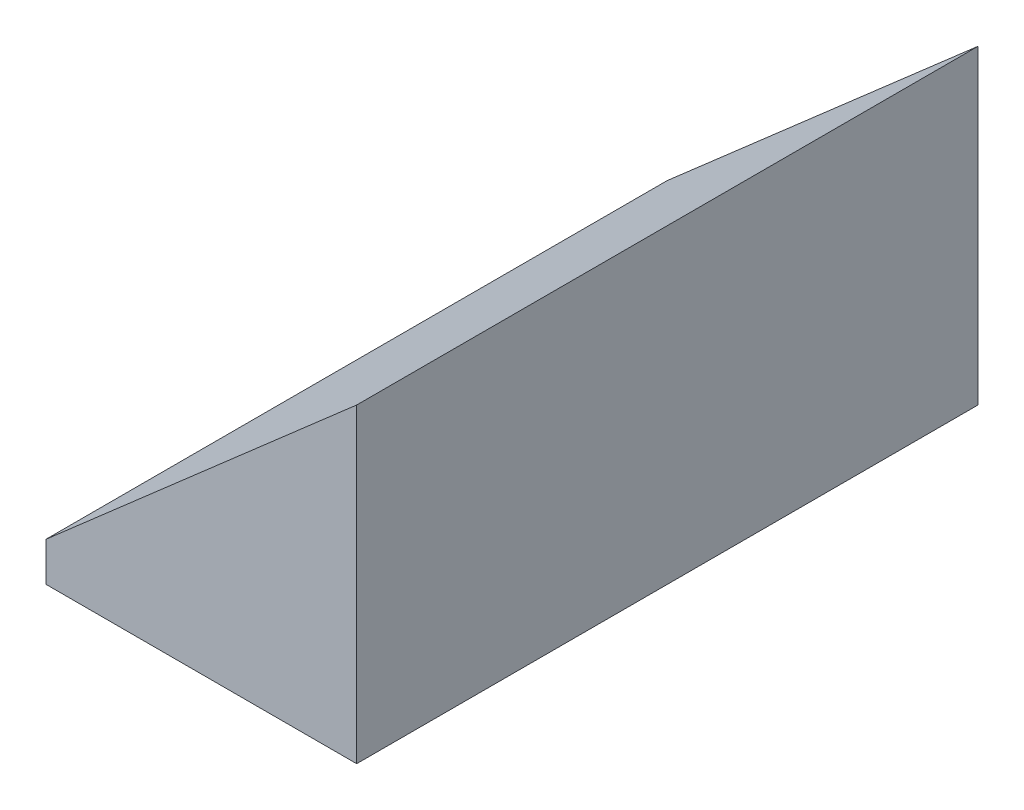
ISO-10303-21;
HEADER;
FILE_DESCRIPTION(('STEP AP214'),'2;1');
FILE_NAME('part.step','',(''),(''),'','','');
FILE_SCHEMA(('AUTOMOTIVE_DESIGN { 1 0 10303 214 1 1 1 1 }'));
ENDSEC;
DATA;
#1=APPLICATION_CONTEXT('core data for automotive mechanical design processes');
#2=APPLICATION_PROTOCOL_DEFINITION('international standard','automotive_design',2000,#1);
#3=PRODUCT_CONTEXT('',#1,'mechanical');
#4=PRODUCT('Part','Part','',(#3));
#5=PRODUCT_RELATED_PRODUCT_CATEGORY('part','',(#4));
#6=PRODUCT_DEFINITION_FORMATION('','',#4);
#7=PRODUCT_DEFINITION_CONTEXT('part definition',#1,'design');
#8=PRODUCT_DEFINITION('design','',#6,#7);
#9=PRODUCT_DEFINITION_SHAPE('','',#8);
#10=(LENGTH_UNIT() NAMED_UNIT(*) SI_UNIT(.MILLI.,.METRE.));
#11=(NAMED_UNIT(*) PLANE_ANGLE_UNIT() SI_UNIT($,.RADIAN.));
#12=(NAMED_UNIT(*) SI_UNIT($,.STERADIAN.) SOLID_ANGLE_UNIT());
#13=UNCERTAINTY_MEASURE_WITH_UNIT(LENGTH_MEASURE(1.E-05),#10,'distance_accuracy_value','');
#14=(GEOMETRIC_REPRESENTATION_CONTEXT(3) GLOBAL_UNCERTAINTY_ASSIGNED_CONTEXT((#13)) GLOBAL_UNIT_ASSIGNED_CONTEXT((#10,
#11,#12)) REPRESENTATION_CONTEXT('',''));
#15=CARTESIAN_POINT('',(0.,0.,0.));
#16=DIRECTION('',(0.,0.,1.));
#17=DIRECTION('',(1.,0.,0.));
#18=AXIS2_PLACEMENT_3D('',#15,#16,#17);
#19=CARTESIAN_POINT('',(-7.95,0.,-15.9));
#20=DIRECTION('',(0.,-1.,0.));
#21=DIRECTION('',(0.,0.,-1.));
#22=AXIS2_PLACEMENT_3D('',#19,#20,#21);
#23=PLANE('',#22);
#24=DIRECTION('',(1.,0.,0.));
#25=VECTOR('',#24,1.);
#26=CARTESIAN_POINT('',(-7.95,0.,0.));
#27=LINE('',#26,#25);
#28=CARTESIAN_POINT('',(-7.95,0.,0.));
#29=VERTEX_POINT('',#28);
#30=CARTESIAN_POINT('',(0.,0.,0.));
#31=VERTEX_POINT('',#30);
#32=EDGE_CURVE('E156',#29,#31,#27,.T.);
#33=ORIENTED_EDGE('',*,*,#32,.F.);
#34=DIRECTION('',(0.,0.,1.));
#35=VECTOR('',#34,1.);
#36=CARTESIAN_POINT('',(-7.95,0.,-15.9));
#37=LINE('',#36,#35);
#38=CARTESIAN_POINT('',(-7.95,0.,-15.9));
#39=VERTEX_POINT('',#38);
#40=EDGE_CURVE('E47',#39,#29,#37,.T.);
#41=ORIENTED_EDGE('',*,*,#40,.F.);
#42=DIRECTION('',(1.,0.,0.));
#43=VECTOR('',#42,1.);
#44=CARTESIAN_POINT('',(-7.95,0.,-15.9));
#45=LINE('',#44,#43);
#46=CARTESIAN_POINT('',(0.,0.,-15.9));
#47=VERTEX_POINT('',#46);
#48=EDGE_CURVE('E163',#39,#47,#45,.T.);
#49=ORIENTED_EDGE('',*,*,#48,.T.);
#50=DIRECTION('',(0.,0.,1.));
#51=VECTOR('',#50,1.);
#52=CARTESIAN_POINT('',(0.,0.,-15.9));
#53=LINE('',#52,#51);
#54=EDGE_CURVE('E88',#47,#31,#53,.T.);
#55=ORIENTED_EDGE('',*,*,#54,.T.);
#56=EDGE_LOOP('',(#33,#41,#49,#55));
#57=FACE_BOUND('',#56,.T.);
#58=DIRECTION('',(0.,0.,1.));
#59=VECTOR('',#58,1.);
#60=CARTESIAN_POINT('',(-7.65,0.,-15.9));
#61=LINE('',#60,#59);
#62=CARTESIAN_POINT('',(-7.65,0.,-15.6));
#63=VERTEX_POINT('',#62);
#64=CARTESIAN_POINT('',(-7.65,0.,-0.3));
#65=VERTEX_POINT('',#64);
#66=EDGE_CURVE('E125',#63,#65,#61,.T.);
#67=ORIENTED_EDGE('',*,*,#66,.T.);
#68=DIRECTION('',(1.,0.,0.));
#69=VECTOR('',#68,1.);
#70=CARTESIAN_POINT('',(0.,0.,-0.3));
#71=LINE('',#70,#69);
#72=CARTESIAN_POINT('',(-0.3,0.,-0.3));
#73=VERTEX_POINT('',#72);
#74=EDGE_CURVE('E151',#65,#73,#71,.T.);
#75=ORIENTED_EDGE('',*,*,#74,.T.);
#76=DIRECTION('',(0.,0.,1.));
#77=VECTOR('',#76,1.);
#78=CARTESIAN_POINT('',(-0.3,0.,-15.9));
#79=LINE('',#78,#77);
#80=CARTESIAN_POINT('',(-0.3,0.,-15.6));
#81=VERTEX_POINT('',#80);
#82=EDGE_CURVE('E136',#81,#73,#79,.T.);
#83=ORIENTED_EDGE('',*,*,#82,.F.);
#84=DIRECTION('',(1.,0.,0.));
#85=VECTOR('',#84,1.);
#86=CARTESIAN_POINT('',(0.,0.,-15.6));
#87=LINE('',#86,#85);
#88=EDGE_CURVE('E54',#63,#81,#87,.T.);
#89=ORIENTED_EDGE('',*,*,#88,.F.);
#90=EDGE_LOOP('',(#67,#75,#83,#89));
#91=FACE_BOUND('',#90,.T.);
#92=ADVANCED_FACE('F39',(#57,#91),#23,.T.);
#93=CARTESIAN_POINT('',(-7.95,0.,-15.9));
#94=DIRECTION('',(-1.,0.,0.));
#95=DIRECTION('',(0.,0.,1.));
#96=AXIS2_PLACEMENT_3D('',#93,#94,#95);
#97=PLANE('',#96);
#98=DIRECTION('',(0.,-1.,0.));
#99=VECTOR('',#98,1.);
#100=CARTESIAN_POINT('',(-7.95,0.,0.));
#101=LINE('',#100,#99);
#102=CARTESIAN_POINT('',(-7.95,1.,0.));
#103=VERTEX_POINT('',#102);
#104=EDGE_CURVE('E167',#103,#29,#101,.T.);
#105=ORIENTED_EDGE('',*,*,#104,.F.);
#106=DIRECTION('',(0.,0.,1.));
#107=VECTOR('',#106,1.);
#108=CARTESIAN_POINT('',(-7.95,1.,-15.9));
#109=LINE('',#108,#107);
#110=CARTESIAN_POINT('',(-7.95,1.,-15.9));
#111=VERTEX_POINT('',#110);
#112=EDGE_CURVE('E193',#111,#103,#109,.T.);
#113=ORIENTED_EDGE('',*,*,#112,.F.);
#114=DIRECTION('',(0.,-1.,0.));
#115=VECTOR('',#114,1.);
#116=CARTESIAN_POINT('',(-7.95,0.,-15.9));
#117=LINE('',#116,#115);
#118=EDGE_CURVE('E174',#111,#39,#117,.T.);
#119=ORIENTED_EDGE('',*,*,#118,.T.);
#120=ORIENTED_EDGE('',*,*,#40,.T.);
#121=EDGE_LOOP('',(#105,#113,#119,#120));
#122=FACE_BOUND('',#121,.T.);
#123=ADVANCED_FACE('F204',(#122),#97,.T.);
#124=CARTESIAN_POINT('',(-7.95,1.,-15.9));
#125=DIRECTION('',(-0.65816931910224,0.7528699405558,0.));
#126=DIRECTION('',(-0.7528699405558,-0.65816931910224,0.));
#127=AXIS2_PLACEMENT_3D('',#124,#125,#126);
#128=PLANE('',#127);
#129=DIRECTION('',(-0.7528699405558,-0.65816931910224,0.));
#130=VECTOR('',#129,1.);
#131=CARTESIAN_POINT('',(-7.95,1.,0.));
#132=LINE('',#131,#130);
#133=CARTESIAN_POINT('',(0.,7.95,0.));
#134=VERTEX_POINT('',#133);
#135=EDGE_CURVE('E184',#134,#103,#132,.T.);
#136=ORIENTED_EDGE('',*,*,#135,.F.);
#137=DIRECTION('',(0.,0.,1.));
#138=VECTOR('',#137,1.);
#139=CARTESIAN_POINT('',(0.,7.95,-15.9));
#140=LINE('',#139,#138);
#141=CARTESIAN_POINT('',(0.,7.95,-15.9));
#142=VERTEX_POINT('',#141);
#143=EDGE_CURVE('E196',#142,#134,#140,.T.);
#144=ORIENTED_EDGE('',*,*,#143,.F.);
#145=DIRECTION('',(-0.7528699405558,-0.65816931910224,0.));
#146=VECTOR('',#145,1.);
#147=CARTESIAN_POINT('',(-7.95,1.,-15.9));
#148=LINE('',#147,#146);
#149=EDGE_CURVE('E170',#142,#111,#148,.T.);
#150=ORIENTED_EDGE('',*,*,#149,.T.);
#151=ORIENTED_EDGE('',*,*,#112,.T.);
#152=EDGE_LOOP('',(#136,#144,#150,#151));
#153=FACE_BOUND('',#152,.T.);
#154=ADVANCED_FACE('F208',(#153),#128,.T.);
#155=CARTESIAN_POINT('',(0.,0.,-15.9));
#156=DIRECTION('',(1.,0.,0.));
#157=DIRECTION('',(0.,0.,-1.));
#158=AXIS2_PLACEMENT_3D('',#155,#156,#157);
#159=PLANE('',#158);
#160=DIRECTION('',(0.,1.,0.));
#161=VECTOR('',#160,1.);
#162=CARTESIAN_POINT('',(0.,0.,0.));
#163=LINE('',#162,#161);
#164=EDGE_CURVE('E180',#31,#134,#163,.T.);
#165=ORIENTED_EDGE('',*,*,#164,.F.);
#166=ORIENTED_EDGE('',*,*,#54,.F.);
#167=DIRECTION('',(0.,1.,0.));
#168=VECTOR('',#167,1.);
#169=CARTESIAN_POINT('',(0.,0.,-15.9));
#170=LINE('',#169,#168);
#171=EDGE_CURVE('E166',#47,#142,#170,.T.);
#172=ORIENTED_EDGE('',*,*,#171,.T.);
#173=ORIENTED_EDGE('',*,*,#143,.T.);
#174=EDGE_LOOP('',(#165,#166,#172,#173));
#175=FACE_BOUND('',#174,.T.);
#176=ADVANCED_FACE('F200',(#175),#159,.T.);
#177=CARTESIAN_POINT('',(0.,0.,-15.9));
#178=DIRECTION('',(0.,0.,1.));
#179=DIRECTION('',(1.,0.,0.));
#180=AXIS2_PLACEMENT_3D('',#177,#178,#179);
#181=PLANE('',#180);
#182=ORIENTED_EDGE('',*,*,#48,.F.);
#183=ORIENTED_EDGE('',*,*,#118,.F.);
#184=ORIENTED_EDGE('',*,*,#149,.F.);
#185=ORIENTED_EDGE('',*,*,#171,.F.);
#186=EDGE_LOOP('',(#182,#183,#184,#185));
#187=FACE_BOUND('',#186,.T.);
#188=ADVANCED_FACE('F210',(#187),#181,.F.);
#189=CARTESIAN_POINT('',(0.,0.,0.));
#190=DIRECTION('',(0.,0.,1.));
#191=DIRECTION('',(1.,0.,0.));
#192=AXIS2_PLACEMENT_3D('',#189,#190,#191);
#193=PLANE('',#192);
#194=ORIENTED_EDGE('',*,*,#32,.T.);
#195=ORIENTED_EDGE('',*,*,#164,.T.);
#196=ORIENTED_EDGE('',*,*,#135,.T.);
#197=ORIENTED_EDGE('',*,*,#104,.T.);
#198=EDGE_LOOP('',(#194,#195,#196,#197));
#199=FACE_BOUND('',#198,.T.);
#200=ADVANCED_FACE('F203',(#199),#193,.T.);
#201=CARTESIAN_POINT('',(-7.65,0.,-15.9));
#202=DIRECTION('',(-1.,0.,0.));
#203=DIRECTION('',(0.,0.,1.));
#204=AXIS2_PLACEMENT_3D('',#201,#202,#203);
#205=PLANE('',#204);
#206=DIRECTION('',(0.,-1.,0.));
#207=VECTOR('',#206,1.);
#208=CARTESIAN_POINT('',(-7.65,0.,-0.3));
#209=LINE('',#208,#207);
#210=CARTESIAN_POINT('',(-7.65,0.863788951125314,-0.3));
#211=VERTEX_POINT('',#210);
#212=EDGE_CURVE('E144',#211,#65,#209,.T.);
#213=ORIENTED_EDGE('',*,*,#212,.T.);
#214=ORIENTED_EDGE('',*,*,#66,.F.);
#215=DIRECTION('',(0.,-1.,0.));
#216=VECTOR('',#215,1.);
#217=CARTESIAN_POINT('',(-7.65,0.,-15.6));
#218=LINE('',#217,#216);
#219=CARTESIAN_POINT('',(-7.65,0.863788951125314,-15.6));
#220=VERTEX_POINT('',#219);
#221=EDGE_CURVE('E129',#220,#63,#218,.T.);
#222=ORIENTED_EDGE('',*,*,#221,.F.);
#223=DIRECTION('',(0.,0.,1.));
#224=VECTOR('',#223,1.);
#225=CARTESIAN_POINT('',(-7.65,0.863788951125314,-15.9));
#226=LINE('',#225,#224);
#227=EDGE_CURVE('E114',#220,#211,#226,.T.);
#228=ORIENTED_EDGE('',*,*,#227,.T.);
#229=EDGE_LOOP('',(#213,#214,#222,#228));
#230=FACE_BOUND('',#229,.T.);
#231=ADVANCED_FACE('F133',(#230),#205,.F.);
#232=CARTESIAN_POINT('',(-7.75254920426933,0.77413901783326,-15.9));
#233=DIRECTION('',(-0.65816931910224,0.7528699405558,0.));
#234=DIRECTION('',(-0.7528699405558,-0.65816931910224,0.));
#235=AXIS2_PLACEMENT_3D('',#232,#233,#234);
#236=PLANE('',#235);
#237=CARTESIAN_POINT('',(-3.975,4.07652480018192,-7.95));
#238=DIRECTION('',(-0.65816931910224,0.7528699405558,0.));
#239=DIRECTION('',(-0.7528699405558,-0.65816931910224,0.));
#240=AXIS2_PLACEMENT_3D('',#237,#238,#239);
#241=ELLIPSE('',#240,1.99237599909041,1.5);
#242=CARTESIAN_POINT('',(-5.475,2.76520404546494,-7.95));
#243=VERTEX_POINT('',#242);
#244=EDGE_CURVE('E11',#243,#243,#241,.F.);
#245=ORIENTED_EDGE('',*,*,#244,.F.);
#246=EDGE_LOOP('',(#245));
#247=FACE_BOUND('',#246,.T.);
#248=DIRECTION('',(-0.7528699405558,-0.65816931910224,0.));
#249=VECTOR('',#248,1.);
#250=CARTESIAN_POINT('',(-3.74190057864716,4.28030353960358,-0.3));
#251=LINE('',#250,#249);
#252=CARTESIAN_POINT('',(-0.3,7.28926064923852,-0.3));
#253=VERTEX_POINT('',#252);
#254=EDGE_CURVE('E119',#253,#211,#251,.T.);
#255=ORIENTED_EDGE('',*,*,#254,.T.);
#256=ORIENTED_EDGE('',*,*,#227,.F.);
#257=DIRECTION('',(-0.7528699405558,-0.65816931910224,0.));
#258=VECTOR('',#257,1.);
#259=CARTESIAN_POINT('',(-3.74190057864716,4.28030353960358,-15.6));
#260=LINE('',#259,#258);
#261=CARTESIAN_POINT('',(-0.3,7.28926064923852,-15.6));
#262=VERTEX_POINT('',#261);
#263=EDGE_CURVE('E117',#262,#220,#260,.T.);
#264=ORIENTED_EDGE('',*,*,#263,.F.);
#265=DIRECTION('',(0.,0.,1.));
#266=VECTOR('',#265,1.);
#267=CARTESIAN_POINT('',(-0.3,7.28926064923852,-15.9));
#268=LINE('',#267,#266);
#269=EDGE_CURVE('E126',#262,#253,#268,.T.);
#270=ORIENTED_EDGE('',*,*,#269,.T.);
#271=EDGE_LOOP('',(#255,#256,#264,#270));
#272=FACE_BOUND('',#271,.T.);
#273=ADVANCED_FACE('F116',(#247,#272),#236,.F.);
#274=CARTESIAN_POINT('',(-0.3,0.,-15.9));
#275=DIRECTION('',(1.,0.,0.));
#276=DIRECTION('',(0.,0.,-1.));
#277=AXIS2_PLACEMENT_3D('',#274,#275,#276);
#278=PLANE('',#277);
#279=DIRECTION('',(0.,1.,0.));
#280=VECTOR('',#279,1.);
#281=CARTESIAN_POINT('',(-0.3,0.,-0.3));
#282=LINE('',#281,#280);
#283=EDGE_CURVE('E145',#73,#253,#282,.T.);
#284=ORIENTED_EDGE('',*,*,#283,.T.);
#285=ORIENTED_EDGE('',*,*,#269,.F.);
#286=DIRECTION('',(0.,1.,0.));
#287=VECTOR('',#286,1.);
#288=CARTESIAN_POINT('',(-0.3,0.,-15.6));
#289=LINE('',#288,#287);
#290=EDGE_CURVE('E130',#81,#262,#289,.T.);
#291=ORIENTED_EDGE('',*,*,#290,.F.);
#292=ORIENTED_EDGE('',*,*,#82,.T.);
#293=EDGE_LOOP('',(#284,#285,#291,#292));
#294=FACE_BOUND('',#293,.T.);
#295=ADVANCED_FACE('F263',(#294),#278,.F.);
#296=CARTESIAN_POINT('',(0.,0.,-15.6));
#297=DIRECTION('',(0.,0.,1.));
#298=DIRECTION('',(1.,0.,0.));
#299=AXIS2_PLACEMENT_3D('',#296,#297,#298);
#300=PLANE('',#299);
#301=ORIENTED_EDGE('',*,*,#88,.T.);
#302=ORIENTED_EDGE('',*,*,#290,.T.);
#303=ORIENTED_EDGE('',*,*,#263,.T.);
#304=ORIENTED_EDGE('',*,*,#221,.T.);
#305=EDGE_LOOP('',(#301,#302,#303,#304));
#306=FACE_BOUND('',#305,.T.);
#307=ADVANCED_FACE('F128',(#306),#300,.T.);
#308=CARTESIAN_POINT('',(0.,0.,-0.3));
#309=DIRECTION('',(0.,0.,1.));
#310=DIRECTION('',(1.,0.,0.));
#311=AXIS2_PLACEMENT_3D('',#308,#309,#310);
#312=PLANE('',#311);
#313=ORIENTED_EDGE('',*,*,#74,.F.);
#314=ORIENTED_EDGE('',*,*,#212,.F.);
#315=ORIENTED_EDGE('',*,*,#254,.F.);
#316=ORIENTED_EDGE('',*,*,#283,.F.);
#317=EDGE_LOOP('',(#313,#314,#315,#316));
#318=FACE_BOUND('',#317,.T.);
#319=ADVANCED_FACE('F277',(#318),#312,.F.);
#320=CARTESIAN_POINT('',(-3.975,9.01549030300186,-7.95));
#321=DIRECTION('',(0.,-1.,0.));
#322=DIRECTION('',(0.,0.,-1.));
#323=AXIS2_PLACEMENT_3D('',#320,#321,#322);
#324=CYLINDRICAL_SURFACE('',#323,1.5);
#325=CARTESIAN_POINT('',(-3.975,0.,-7.95));
#326=DIRECTION('',(0.,1.,0.));
#327=DIRECTION('',(0.,0.,1.));
#328=AXIS2_PLACEMENT_3D('',#325,#326,#327);
#329=CIRCLE('',#328,1.5);
#330=CARTESIAN_POINT('',(-3.975,0.,-6.45));
#331=VERTEX_POINT('',#330);
#332=EDGE_CURVE('E162',#331,#331,#329,.T.);
#333=ORIENTED_EDGE('',*,*,#332,.T.);
#334=EDGE_LOOP('',(#333));
#335=FACE_BOUND('',#334,.T.);
#336=ORIENTED_EDGE('',*,*,#244,.T.);
#337=EDGE_LOOP('',(#336));
#338=FACE_BOUND('',#337,.T.);
#339=ADVANCED_FACE('F286',(#335,#338),#324,.T.);
#340=CARTESIAN_POINT('',(-3.975,0.,-7.95));
#341=DIRECTION('',(0.,1.,0.));
#342=DIRECTION('',(0.,0.,1.));
#343=AXIS2_PLACEMENT_3D('',#340,#341,#342);
#344=PLANE('',#343);
#345=ORIENTED_EDGE('',*,*,#332,.F.);
#346=EDGE_LOOP('',(#345));
#347=FACE_BOUND('',#346,.T.);
#348=CARTESIAN_POINT('',(-3.975,0.,-7.95));
#349=DIRECTION('',(0.,1.,0.));
#350=DIRECTION('',(0.,0.,1.));
#351=AXIS2_PLACEMENT_3D('',#348,#349,#350);
#352=CIRCLE('',#351,0.5);
#353=CARTESIAN_POINT('',(-3.975,0.,-7.45));
#354=VERTEX_POINT('',#353);
#355=EDGE_CURVE('E340',#354,#354,#352,.T.);
#356=ORIENTED_EDGE('',*,*,#355,.T.);
#357=EDGE_LOOP('',(#356));
#358=FACE_BOUND('',#357,.T.);
#359=ADVANCED_FACE('F304',(#347,#358),#344,.F.);
#360=CARTESIAN_POINT('',(-3.975,9.01549030300186,-7.95));
#361=DIRECTION('',(0.,-1.,0.));
#362=DIRECTION('',(0.,0.,-1.));
#363=AXIS2_PLACEMENT_3D('',#360,#361,#362);
#364=CYLINDRICAL_SURFACE('',#363,0.5);
#365=ORIENTED_EDGE('',*,*,#355,.F.);
#366=EDGE_LOOP('',(#365));
#367=FACE_BOUND('',#366,.T.);
#368=CARTESIAN_POINT('',(-3.975,4.07652480018192,-7.95));
#369=DIRECTION('',(-0.65816931910224,0.7528699405558,0.));
#370=DIRECTION('',(-0.7528699405558,-0.65816931910224,0.));
#371=AXIS2_PLACEMENT_3D('',#368,#369,#370);
#372=ELLIPSE('',#371,0.664125333030137,0.5);
#373=CARTESIAN_POINT('',(-4.475,3.63941788194292,-7.95));
#374=VERTEX_POINT('',#373);
#375=EDGE_CURVE('E337',#374,#374,#372,.T.);
#376=ORIENTED_EDGE('',*,*,#375,.T.);
#377=EDGE_LOOP('',(#376));
#378=FACE_BOUND('',#377,.T.);
#379=ADVANCED_FACE('F314',(#367,#378),#364,.F.);
#380=ORIENTED_EDGE('',*,*,#375,.F.);
#381=EDGE_LOOP('',(#380));
#382=FACE_BOUND('',#381,.T.);
#383=ADVANCED_FACE('F297',(#382),#236,.F.);
#384=CLOSED_SHELL('',(#92,#123,#154,#176,#188,#200,#231,#273,#295,#307,#319,#339,#359,#379,#383));
#385=MANIFOLD_SOLID_BREP('B2',#384);
#386=ADVANCED_BREP_SHAPE_REPRESENTATION('',(#18,#385),#14);
#387=SHAPE_DEFINITION_REPRESENTATION(#9,#386);
ENDSEC;
END-ISO-10303-21;
